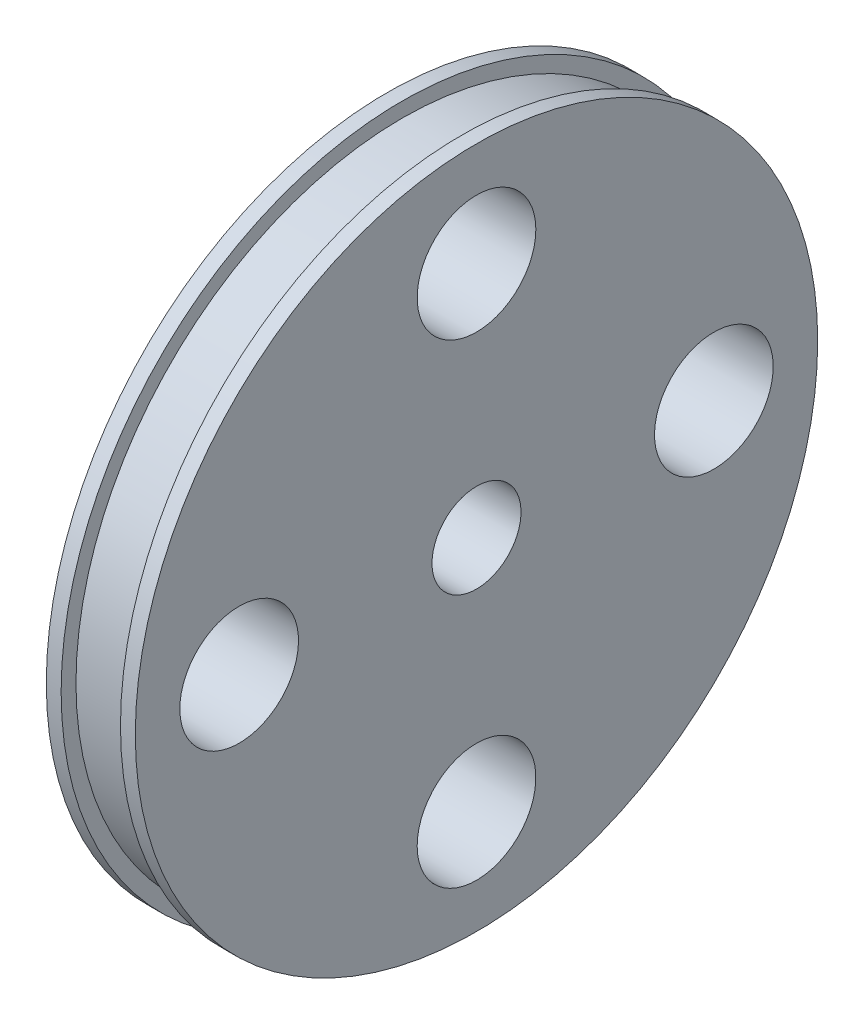
ISO-10303-21;
HEADER;
FILE_DESCRIPTION(('STEP AP214'),'2;1');
FILE_NAME('part.step','',(''),(''),'','','');
FILE_SCHEMA(('AUTOMOTIVE_DESIGN { 1 0 10303 214 1 1 1 1 }'));
ENDSEC;
DATA;
#1=APPLICATION_CONTEXT('core data for automotive mechanical design processes');
#2=APPLICATION_PROTOCOL_DEFINITION('international standard','automotive_design',2000,#1);
#3=PRODUCT_CONTEXT('',#1,'mechanical');
#4=PRODUCT('Part','Part','',(#3));
#5=PRODUCT_RELATED_PRODUCT_CATEGORY('part','',(#4));
#6=PRODUCT_DEFINITION_FORMATION('','',#4);
#7=PRODUCT_DEFINITION_CONTEXT('part definition',#1,'design');
#8=PRODUCT_DEFINITION('design','',#6,#7);
#9=PRODUCT_DEFINITION_SHAPE('','',#8);
#10=(LENGTH_UNIT() NAMED_UNIT(*) SI_UNIT(.MILLI.,.METRE.));
#11=(NAMED_UNIT(*) PLANE_ANGLE_UNIT() SI_UNIT($,.RADIAN.));
#12=(NAMED_UNIT(*) SI_UNIT($,.STERADIAN.) SOLID_ANGLE_UNIT());
#13=UNCERTAINTY_MEASURE_WITH_UNIT(LENGTH_MEASURE(1.E-05),#10,'distance_accuracy_value','');
#14=(GEOMETRIC_REPRESENTATION_CONTEXT(3) GLOBAL_UNCERTAINTY_ASSIGNED_CONTEXT((#13)) GLOBAL_UNIT_ASSIGNED_CONTEXT((#10,
#11,#12)) REPRESENTATION_CONTEXT('',''));
#15=CARTESIAN_POINT('',(0.,0.,0.));
#16=DIRECTION('',(0.,0.,1.));
#17=DIRECTION('',(1.,0.,0.));
#18=AXIS2_PLACEMENT_3D('',#15,#16,#17);
#19=CARTESIAN_POINT('',(-34.6097859604571,-15.,0.));
#20=DIRECTION('',(-1.,0.,0.));
#21=DIRECTION('',(0.,0.,1.));
#22=AXIS2_PLACEMENT_3D('',#19,#20,#21);
#23=CYLINDRICAL_SURFACE('',#22,15.);
#24=CARTESIAN_POINT('',(30.,-15.,0.));
#25=DIRECTION('',(-1.,0.,0.));
#26=DIRECTION('',(0.,0.,1.));
#27=AXIS2_PLACEMENT_3D('',#24,#25,#26);
#28=CIRCLE('',#27,15.);
#29=CARTESIAN_POINT('',(30.,-15.,15.));
#30=VERTEX_POINT('',#29);
#31=EDGE_CURVE('E65',#30,#30,#28,.T.);
#32=ORIENTED_EDGE('',*,*,#31,.F.);
#33=EDGE_LOOP('',(#32));
#34=FACE_BOUND('',#33,.T.);
#35=CARTESIAN_POINT('',(0.,-15.,0.));
#36=DIRECTION('',(-1.,0.,0.));
#37=DIRECTION('',(0.,0.,1.));
#38=AXIS2_PLACEMENT_3D('',#35,#36,#37);
#39=CIRCLE('',#38,15.);
#40=CARTESIAN_POINT('',(0.,-15.,15.));
#41=VERTEX_POINT('',#40);
#42=EDGE_CURVE('E10',#41,#41,#39,.T.);
#43=ORIENTED_EDGE('',*,*,#42,.T.);
#44=EDGE_LOOP('',(#43));
#45=FACE_BOUND('',#44,.T.);
#46=ADVANCED_FACE('F37',(#34,#45),#23,.F.);
#47=CARTESIAN_POINT('',(0.,0.,0.));
#48=DIRECTION('',(1.,0.,0.));
#49=DIRECTION('',(0.,0.,-1.));
#50=AXIS2_PLACEMENT_3D('',#47,#48,#49);
#51=PLANE('',#50);
#52=CARTESIAN_POINT('',(0.,-15.0000000000003,-80.));
#53=DIRECTION('',(1.,0.,0.));
#54=DIRECTION('',(0.,-1.,0.));
#55=AXIS2_PLACEMENT_3D('',#52,#53,#54);
#56=CIRCLE('',#55,20.);
#57=CARTESIAN_POINT('',(0.,-35.0000000000003,-79.9999999999999));
#58=VERTEX_POINT('',#57);
#59=EDGE_CURVE('E85',#58,#58,#56,.T.);
#60=ORIENTED_EDGE('',*,*,#59,.T.);
#61=EDGE_LOOP('',(#60));
#62=FACE_BOUND('',#61,.T.);
#63=CARTESIAN_POINT('',(0.,-95.,0.));
#64=DIRECTION('',(1.,0.,0.));
#65=DIRECTION('',(0.,0.,1.));
#66=AXIS2_PLACEMENT_3D('',#63,#64,#65);
#67=CIRCLE('',#66,20.);
#68=CARTESIAN_POINT('',(0.,-95.,20.));
#69=VERTEX_POINT('',#68);
#70=EDGE_CURVE('E78',#69,#69,#67,.T.);
#71=ORIENTED_EDGE('',*,*,#70,.T.);
#72=EDGE_LOOP('',(#71));
#73=FACE_BOUND('',#72,.T.);
#74=CARTESIAN_POINT('',(0.,-14.9999999999992,80.));
#75=DIRECTION('',(1.,0.,0.));
#76=DIRECTION('',(0.,1.,0.));
#77=AXIS2_PLACEMENT_3D('',#74,#75,#76);
#78=CIRCLE('',#77,20.);
#79=CARTESIAN_POINT('',(0.,5.00000000000084,79.9999999999998));
#80=VERTEX_POINT('',#79);
#81=EDGE_CURVE('E79',#80,#80,#78,.T.);
#82=ORIENTED_EDGE('',*,*,#81,.T.);
#83=EDGE_LOOP('',(#82));
#84=FACE_BOUND('',#83,.T.);
#85=CARTESIAN_POINT('',(0.,65.,0.));
#86=DIRECTION('',(1.,0.,0.));
#87=DIRECTION('',(0.,0.,-1.));
#88=AXIS2_PLACEMENT_3D('',#85,#86,#87);
#89=CIRCLE('',#88,20.);
#90=CARTESIAN_POINT('',(0.,65.,-20.));
#91=VERTEX_POINT('',#90);
#92=EDGE_CURVE('E68',#91,#91,#89,.T.);
#93=ORIENTED_EDGE('',*,*,#92,.T.);
#94=EDGE_LOOP('',(#93));
#95=FACE_BOUND('',#94,.T.);
#96=ORIENTED_EDGE('',*,*,#42,.F.);
#97=EDGE_LOOP('',(#96));
#98=FACE_BOUND('',#97,.T.);
#99=CARTESIAN_POINT('',(0.,-15.,0.));
#100=DIRECTION('',(-1.,0.,0.));
#101=DIRECTION('',(0.,0.,1.));
#102=AXIS2_PLACEMENT_3D('',#99,#100,#101);
#103=CIRCLE('',#102,115.);
#104=CARTESIAN_POINT('',(0.,-15.,115.));
#105=VERTEX_POINT('',#104);
#106=EDGE_CURVE('E43',#105,#105,#103,.T.);
#107=ORIENTED_EDGE('',*,*,#106,.T.);
#108=EDGE_LOOP('',(#107));
#109=FACE_BOUND('',#108,.T.);
#110=ADVANCED_FACE('F93',(#62,#73,#84,#95,#98,#109),#51,.F.);
#111=CARTESIAN_POINT('',(-34.6097859604571,-15.,0.));
#112=DIRECTION('',(-1.,0.,0.));
#113=DIRECTION('',(0.,0.,1.));
#114=AXIS2_PLACEMENT_3D('',#111,#112,#113);
#115=CYLINDRICAL_SURFACE('',#114,115.);
#116=ORIENTED_EDGE('',*,*,#106,.F.);
#117=EDGE_LOOP('',(#116));
#118=FACE_BOUND('',#117,.T.);
#119=CARTESIAN_POINT('',(5.,-15.,0.));
#120=DIRECTION('',(-1.,0.,0.));
#121=DIRECTION('',(0.,0.,1.));
#122=AXIS2_PLACEMENT_3D('',#119,#120,#121);
#123=CIRCLE('',#122,115.);
#124=CARTESIAN_POINT('',(5.,-15.,115.));
#125=VERTEX_POINT('',#124);
#126=EDGE_CURVE('E47',#125,#125,#123,.T.);
#127=ORIENTED_EDGE('',*,*,#126,.T.);
#128=EDGE_LOOP('',(#127));
#129=FACE_BOUND('',#128,.T.);
#130=ADVANCED_FACE('F124',(#118,#129),#115,.T.);
#131=CARTESIAN_POINT('',(5.,100.,0.));
#132=DIRECTION('',(-1.,0.,0.));
#133=DIRECTION('',(0.,0.,1.));
#134=AXIS2_PLACEMENT_3D('',#131,#132,#133);
#135=PLANE('',#134);
#136=ORIENTED_EDGE('',*,*,#126,.F.);
#137=EDGE_LOOP('',(#136));
#138=FACE_BOUND('',#137,.T.);
#139=CARTESIAN_POINT('',(5.,-15.,0.));
#140=DIRECTION('',(-1.,0.,0.));
#141=DIRECTION('',(0.,0.,1.));
#142=AXIS2_PLACEMENT_3D('',#139,#140,#141);
#143=CIRCLE('',#142,110.);
#144=CARTESIAN_POINT('',(5.,-15.,110.));
#145=VERTEX_POINT('',#144);
#146=EDGE_CURVE('E51',#145,#145,#143,.T.);
#147=ORIENTED_EDGE('',*,*,#146,.T.);
#148=EDGE_LOOP('',(#147));
#149=FACE_BOUND('',#148,.T.);
#150=ADVANCED_FACE('F128',(#138,#149),#135,.F.);
#151=CARTESIAN_POINT('',(-34.6097859604571,-15.,0.));
#152=DIRECTION('',(-1.,0.,0.));
#153=DIRECTION('',(0.,0.,1.));
#154=AXIS2_PLACEMENT_3D('',#151,#152,#153);
#155=CYLINDRICAL_SURFACE('',#154,110.);
#156=ORIENTED_EDGE('',*,*,#146,.F.);
#157=EDGE_LOOP('',(#156));
#158=FACE_BOUND('',#157,.T.);
#159=CARTESIAN_POINT('',(25.,-15.,0.));
#160=DIRECTION('',(-1.,0.,0.));
#161=DIRECTION('',(0.,0.,1.));
#162=AXIS2_PLACEMENT_3D('',#159,#160,#161);
#163=CIRCLE('',#162,110.);
#164=CARTESIAN_POINT('',(25.,-15.,110.));
#165=VERTEX_POINT('',#164);
#166=EDGE_CURVE('E56',#165,#165,#163,.T.);
#167=ORIENTED_EDGE('',*,*,#166,.T.);
#168=EDGE_LOOP('',(#167));
#169=FACE_BOUND('',#168,.T.);
#170=ADVANCED_FACE('F134',(#158,#169),#155,.T.);
#171=CARTESIAN_POINT('',(25.,95.,0.));
#172=DIRECTION('',(1.,0.,0.));
#173=DIRECTION('',(0.,0.,-1.));
#174=AXIS2_PLACEMENT_3D('',#171,#172,#173);
#175=PLANE('',#174);
#176=ORIENTED_EDGE('',*,*,#166,.F.);
#177=EDGE_LOOP('',(#176));
#178=FACE_BOUND('',#177,.T.);
#179=CARTESIAN_POINT('',(25.,-15.,0.));
#180=DIRECTION('',(-1.,0.,0.));
#181=DIRECTION('',(0.,0.,1.));
#182=AXIS2_PLACEMENT_3D('',#179,#180,#181);
#183=CIRCLE('',#182,115.);
#184=CARTESIAN_POINT('',(25.,-15.,115.));
#185=VERTEX_POINT('',#184);
#186=EDGE_CURVE('E59',#185,#185,#183,.T.);
#187=ORIENTED_EDGE('',*,*,#186,.T.);
#188=EDGE_LOOP('',(#187));
#189=FACE_BOUND('',#188,.T.);
#190=ADVANCED_FACE('F138',(#178,#189),#175,.F.);
#191=CARTESIAN_POINT('',(-34.6097859604571,-15.,0.));
#192=DIRECTION('',(-1.,0.,0.));
#193=DIRECTION('',(0.,0.,1.));
#194=AXIS2_PLACEMENT_3D('',#191,#192,#193);
#195=CYLINDRICAL_SURFACE('',#194,115.);
#196=ORIENTED_EDGE('',*,*,#186,.F.);
#197=EDGE_LOOP('',(#196));
#198=FACE_BOUND('',#197,.T.);
#199=CARTESIAN_POINT('',(30.,-15.,0.));
#200=DIRECTION('',(-1.,0.,0.));
#201=DIRECTION('',(0.,0.,1.));
#202=AXIS2_PLACEMENT_3D('',#199,#200,#201);
#203=CIRCLE('',#202,115.);
#204=CARTESIAN_POINT('',(30.,-15.,115.));
#205=VERTEX_POINT('',#204);
#206=EDGE_CURVE('E62',#205,#205,#203,.T.);
#207=ORIENTED_EDGE('',*,*,#206,.T.);
#208=EDGE_LOOP('',(#207));
#209=FACE_BOUND('',#208,.T.);
#210=ADVANCED_FACE('F107',(#198,#209),#195,.T.);
#211=CARTESIAN_POINT('',(30.,100.,0.));
#212=DIRECTION('',(-1.,0.,0.));
#213=DIRECTION('',(0.,0.,1.));
#214=AXIS2_PLACEMENT_3D('',#211,#212,#213);
#215=PLANE('',#214);
#216=CARTESIAN_POINT('',(30.,-15.0000000000003,-80.));
#217=DIRECTION('',(1.,0.,0.));
#218=DIRECTION('',(0.,-1.,0.));
#219=AXIS2_PLACEMENT_3D('',#216,#217,#218);
#220=CIRCLE('',#219,20.);
#221=CARTESIAN_POINT('',(30.,-35.0000000000003,-79.9999999999999));
#222=VERTEX_POINT('',#221);
#223=EDGE_CURVE('E72',#222,#222,#220,.T.);
#224=ORIENTED_EDGE('',*,*,#223,.F.);
#225=EDGE_LOOP('',(#224));
#226=FACE_BOUND('',#225,.T.);
#227=CARTESIAN_POINT('',(30.,-95.,0.));
#228=DIRECTION('',(1.,0.,0.));
#229=DIRECTION('',(0.,0.,1.));
#230=AXIS2_PLACEMENT_3D('',#227,#228,#229);
#231=CIRCLE('',#230,20.);
#232=CARTESIAN_POINT('',(30.,-95.,20.));
#233=VERTEX_POINT('',#232);
#234=EDGE_CURVE('E82',#233,#233,#231,.T.);
#235=ORIENTED_EDGE('',*,*,#234,.F.);
#236=EDGE_LOOP('',(#235));
#237=FACE_BOUND('',#236,.T.);
#238=CARTESIAN_POINT('',(30.,-14.9999999999992,80.));
#239=DIRECTION('',(1.,0.,0.));
#240=DIRECTION('',(0.,1.,0.));
#241=AXIS2_PLACEMENT_3D('',#238,#239,#240);
#242=CIRCLE('',#241,20.);
#243=CARTESIAN_POINT('',(30.,5.00000000000084,79.9999999999998));
#244=VERTEX_POINT('',#243);
#245=EDGE_CURVE('E75',#244,#244,#242,.T.);
#246=ORIENTED_EDGE('',*,*,#245,.F.);
#247=EDGE_LOOP('',(#246));
#248=FACE_BOUND('',#247,.T.);
#249=CARTESIAN_POINT('',(30.,65.,0.));
#250=DIRECTION('',(1.,0.,0.));
#251=DIRECTION('',(0.,0.,-1.));
#252=AXIS2_PLACEMENT_3D('',#249,#250,#251);
#253=CIRCLE('',#252,20.);
#254=CARTESIAN_POINT('',(30.,65.,-20.));
#255=VERTEX_POINT('',#254);
#256=EDGE_CURVE('E69',#255,#255,#253,.T.);
#257=ORIENTED_EDGE('',*,*,#256,.F.);
#258=EDGE_LOOP('',(#257));
#259=FACE_BOUND('',#258,.T.);
#260=ORIENTED_EDGE('',*,*,#206,.F.);
#261=EDGE_LOOP('',(#260));
#262=FACE_BOUND('',#261,.T.);
#263=ORIENTED_EDGE('',*,*,#31,.T.);
#264=EDGE_LOOP('',(#263));
#265=FACE_BOUND('',#264,.T.);
#266=ADVANCED_FACE('F103',(#226,#237,#248,#259,#262,#265),#215,.F.);
#267=CARTESIAN_POINT('',(0.,65.,0.));
#268=DIRECTION('',(1.,0.,0.));
#269=DIRECTION('',(0.,0.,-1.));
#270=AXIS2_PLACEMENT_3D('',#267,#268,#269);
#271=CYLINDRICAL_SURFACE('',#270,20.);
#272=ORIENTED_EDGE('',*,*,#92,.F.);
#273=EDGE_LOOP('',(#272));
#274=FACE_BOUND('',#273,.T.);
#275=ORIENTED_EDGE('',*,*,#256,.T.);
#276=EDGE_LOOP('',(#275));
#277=FACE_BOUND('',#276,.T.);
#278=ADVANCED_FACE('F106',(#274,#277),#271,.F.);
#279=CARTESIAN_POINT('',(0.,-14.9999999999992,80.));
#280=DIRECTION('',(1.,0.,0.));
#281=DIRECTION('',(0.,1.,0.));
#282=AXIS2_PLACEMENT_3D('',#279,#280,#281);
#283=CYLINDRICAL_SURFACE('',#282,20.);
#284=ORIENTED_EDGE('',*,*,#81,.F.);
#285=EDGE_LOOP('',(#284));
#286=FACE_BOUND('',#285,.T.);
#287=ORIENTED_EDGE('',*,*,#245,.T.);
#288=EDGE_LOOP('',(#287));
#289=FACE_BOUND('',#288,.T.);
#290=ADVANCED_FACE('F147',(#286,#289),#283,.F.);
#291=CARTESIAN_POINT('',(0.,-95.,0.));
#292=DIRECTION('',(1.,0.,0.));
#293=DIRECTION('',(0.,0.,1.));
#294=AXIS2_PLACEMENT_3D('',#291,#292,#293);
#295=CYLINDRICAL_SURFACE('',#294,20.);
#296=ORIENTED_EDGE('',*,*,#70,.F.);
#297=EDGE_LOOP('',(#296));
#298=FACE_BOUND('',#297,.T.);
#299=ORIENTED_EDGE('',*,*,#234,.T.);
#300=EDGE_LOOP('',(#299));
#301=FACE_BOUND('',#300,.T.);
#302=ADVANCED_FACE('F99',(#298,#301),#295,.F.);
#303=CARTESIAN_POINT('',(0.,-15.0000000000003,-80.));
#304=DIRECTION('',(1.,0.,0.));
#305=DIRECTION('',(0.,-1.,0.));
#306=AXIS2_PLACEMENT_3D('',#303,#304,#305);
#307=CYLINDRICAL_SURFACE('',#306,20.);
#308=ORIENTED_EDGE('',*,*,#59,.F.);
#309=EDGE_LOOP('',(#308));
#310=FACE_BOUND('',#309,.T.);
#311=ORIENTED_EDGE('',*,*,#223,.T.);
#312=EDGE_LOOP('',(#311));
#313=FACE_BOUND('',#312,.T.);
#314=ADVANCED_FACE('F96',(#310,#313),#307,.F.);
#315=CLOSED_SHELL('',(#46,#110,#130,#150,#170,#190,#210,#266,#278,#290,#302,#314));
#316=MANIFOLD_SOLID_BREP('B2',#315);
#317=ADVANCED_BREP_SHAPE_REPRESENTATION('',(#18,#316),#14);
#318=SHAPE_DEFINITION_REPRESENTATION(#9,#317);
ENDSEC;
END-ISO-10303-21;
